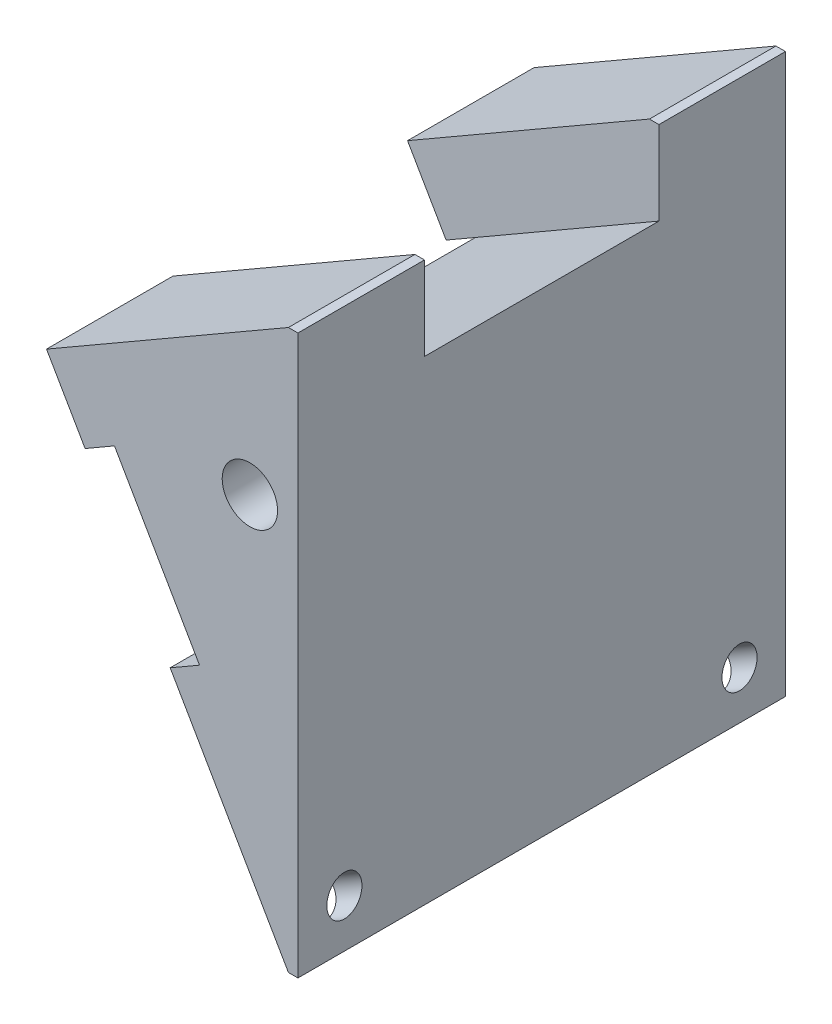
ISO-10303-21;
HEADER;
FILE_DESCRIPTION(('STEP AP214'),'2;1');
FILE_NAME('part.step','',(''),(''),'','','');
FILE_SCHEMA(('AUTOMOTIVE_DESIGN { 1 0 10303 214 1 1 1 1 }'));
ENDSEC;
DATA;
#1=APPLICATION_CONTEXT('core data for automotive mechanical design processes');
#2=APPLICATION_PROTOCOL_DEFINITION('international standard','automotive_design',2000,#1);
#3=PRODUCT_CONTEXT('',#1,'mechanical');
#4=PRODUCT('Part','Part','',(#3));
#5=PRODUCT_RELATED_PRODUCT_CATEGORY('part','',(#4));
#6=PRODUCT_DEFINITION_FORMATION('','',#4);
#7=PRODUCT_DEFINITION_CONTEXT('part definition',#1,'design');
#8=PRODUCT_DEFINITION('design','',#6,#7);
#9=PRODUCT_DEFINITION_SHAPE('','',#8);
#10=(LENGTH_UNIT() NAMED_UNIT(*) SI_UNIT(.MILLI.,.METRE.));
#11=(NAMED_UNIT(*) PLANE_ANGLE_UNIT() SI_UNIT($,.RADIAN.));
#12=(NAMED_UNIT(*) SI_UNIT($,.STERADIAN.) SOLID_ANGLE_UNIT());
#13=UNCERTAINTY_MEASURE_WITH_UNIT(LENGTH_MEASURE(1.E-05),#10,'distance_accuracy_value','');
#14=(GEOMETRIC_REPRESENTATION_CONTEXT(3) GLOBAL_UNCERTAINTY_ASSIGNED_CONTEXT((#13)) GLOBAL_UNIT_ASSIGNED_CONTEXT((#10,
#11,#12)) REPRESENTATION_CONTEXT('',''));
#15=CARTESIAN_POINT('',(0.,0.,0.));
#16=DIRECTION('',(0.,0.,1.));
#17=DIRECTION('',(1.,0.,0.));
#18=AXIS2_PLACEMENT_3D('',#15,#16,#17);
#19=CARTESIAN_POINT('',(2.97818413586759,12.1280444977001,15.2618117725888));
#20=DIRECTION('',(0.,1.,0.));
#21=DIRECTION('',(-1.,0.,0.));
#22=AXIS2_PLACEMENT_3D('',#19,#20,#21);
#23=PLANE('',#22);
#24=DIRECTION('',(1.,0.,0.));
#25=VECTOR('',#24,1.);
#26=CARTESIAN_POINT('',(2.97818413586759,12.1280444977001,-11.6431828959599));
#27=LINE('',#26,#25);
#28=CARTESIAN_POINT('',(-3.23788343563505,12.1280444977,-11.6431828959599));
#29=VERTEX_POINT('',#28);
#30=CARTESIAN_POINT('',(-2.7211971298804,12.1280444977001,-11.6431828959599));
#31=VERTEX_POINT('',#30);
#32=EDGE_CURVE('E56',#29,#31,#27,.T.);
#33=ORIENTED_EDGE('',*,*,#32,.F.);
#34=DIRECTION('',(0.,0.,-1.));
#35=VECTOR('',#34,1.);
#36=CARTESIAN_POINT('',(-3.23788343563506,12.1280444977001,15.2618117725888));
#37=LINE('',#36,#35);
#38=CARTESIAN_POINT('',(-3.23788343563506,12.1280444977001,-4.79068556168559));
#39=VERTEX_POINT('',#38);
#40=EDGE_CURVE('E167',#39,#29,#37,.T.);
#41=ORIENTED_EDGE('',*,*,#40,.F.);
#42=DIRECTION('',(-1.,0.,0.));
#43=VECTOR('',#42,1.);
#44=CARTESIAN_POINT('',(2.97818413586759,12.1280444977001,-4.79068556168559));
#45=LINE('',#44,#43);
#46=CARTESIAN_POINT('',(-2.7211971298804,12.1280444977001,-4.79068556168558));
#47=VERTEX_POINT('',#46);
#48=EDGE_CURVE('E191',#47,#39,#45,.T.);
#49=ORIENTED_EDGE('',*,*,#48,.F.);
#50=DIRECTION('',(0.,0.,-1.));
#51=VECTOR('',#50,1.);
#52=CARTESIAN_POINT('',(-2.7211971298804,12.1280444977001,19.0988171040401));
#53=LINE('',#52,#51);
#54=EDGE_CURVE('E230',#47,#31,#53,.T.);
#55=ORIENTED_EDGE('',*,*,#54,.T.);
#56=EDGE_LOOP('',(#33,#41,#49,#55));
#57=FACE_BOUND('',#56,.T.);
#58=ADVANCED_FACE('F39',(#57),#23,.T.);
#59=CARTESIAN_POINT('',(-15.3378163264363,5.14214498601969,15.2618117725888));
#60=DIRECTION('',(-0.499999999999994,0.866025403784442,0.));
#61=DIRECTION('',(-0.866025403784442,-0.499999999999994,0.));
#62=AXIS2_PLACEMENT_3D('',#59,#60,#61);
#63=PLANE('',#62);
#64=DIRECTION('',(-0.866025403784442,-0.499999999999994,0.));
#65=VECTOR('',#64,1.);
#66=CARTESIAN_POINT('',(0.982624640053907,14.564755971316,-11.6431828959599));
#67=LINE('',#66,#65);
#68=CARTESIAN_POINT('',(-16.3378834356349,4.56475597131613,-11.6431828959599));
#69=VERTEX_POINT('',#68);
#70=EDGE_CURVE('E150',#29,#69,#67,.T.);
#71=ORIENTED_EDGE('',*,*,#70,.T.);
#72=DIRECTION('',(0.,0.,-1.));
#73=VECTOR('',#72,1.);
#74=CARTESIAN_POINT('',(-16.337883435635,4.56475597131615,15.2618117725888));
#75=LINE('',#74,#73);
#76=CARTESIAN_POINT('',(-16.3378834356349,4.56475597131614,-4.79068556168559));
#77=VERTEX_POINT('',#76);
#78=EDGE_CURVE('E165',#77,#69,#75,.T.);
#79=ORIENTED_EDGE('',*,*,#78,.F.);
#80=DIRECTION('',(-0.866025403784441,-0.499999999999996,0.));
#81=VECTOR('',#80,1.);
#82=CARTESIAN_POINT('',(-16.3378834356349,4.56475597131614,-4.79068556168559));
#83=LINE('',#82,#81);
#84=EDGE_CURVE('E274',#39,#77,#83,.T.);
#85=ORIENTED_EDGE('',*,*,#84,.F.);
#86=ORIENTED_EDGE('',*,*,#40,.T.);
#87=EDGE_LOOP('',(#71,#79,#85,#86));
#88=FACE_BOUND('',#87,.T.);
#89=ADVANCED_FACE('F163',(#88),#63,.T.);
#90=CARTESIAN_POINT('',(-15.067883435635,2.36505144570368,15.2618117725888));
#91=DIRECTION('',(-0.866025403784442,-0.499999999999994,0.));
#92=DIRECTION('',(0.499999999999994,-0.866025403784442,0.));
#93=AXIS2_PLACEMENT_3D('',#90,#91,#92);
#94=PLANE('',#93);
#95=DIRECTION('',(-0.499999999999994,0.866025403784442,0.));
#96=VECTOR('',#95,1.);
#97=CARTESIAN_POINT('',(-16.3378834356349,4.56475597131613,-11.6431828959599));
#98=LINE('',#97,#96);
#99=CARTESIAN_POINT('',(-14.2480407854829,0.945042321428329,-11.6431828959599));
#100=VERTEX_POINT('',#99);
#101=EDGE_CURVE('E146',#100,#69,#98,.T.);
#102=ORIENTED_EDGE('',*,*,#101,.F.);
#103=DIRECTION('',(0.,0.,-1.));
#104=VECTOR('',#103,1.);
#105=CARTESIAN_POINT('',(-14.2480407854829,0.945042321428339,15.2618117725888));
#106=LINE('',#105,#104);
#107=CARTESIAN_POINT('',(-14.2480407854829,0.945042321428345,-4.79068556168559));
#108=VERTEX_POINT('',#107);
#109=EDGE_CURVE('E177',#108,#100,#106,.T.);
#110=ORIENTED_EDGE('',*,*,#109,.F.);
#111=DIRECTION('',(-0.499999999999996,0.866025403784441,0.));
#112=VECTOR('',#111,1.);
#113=CARTESIAN_POINT('',(-14.2480407854829,0.945042321428345,-4.79068556168559));
#114=LINE('',#113,#112);
#115=EDGE_CURVE('E173',#108,#77,#114,.T.);
#116=ORIENTED_EDGE('',*,*,#115,.T.);
#117=ORIENTED_EDGE('',*,*,#78,.T.);
#118=EDGE_LOOP('',(#102,#110,#116,#117));
#119=FACE_BOUND('',#118,.T.);
#120=CARTESIAN_POINT('',(-15.337883435635,2.83270516374728,-9.15418822741125));
#121=DIRECTION('',(-0.866025403784442,-0.499999999999994,0.));
#122=DIRECTION('',(0.499999999999994,-0.866025403784442,0.));
#123=AXIS2_PLACEMENT_3D('',#120,#121,#122);
#124=CIRCLE('',#123,0.949999999999999);
#125=CARTESIAN_POINT('',(-14.862883435635,2.00998103015206,-9.15418822741125));
#126=VERTEX_POINT('',#125);
#127=EDGE_CURVE('E250',#126,#126,#124,.T.);
#128=ORIENTED_EDGE('',*,*,#127,.F.);
#129=EDGE_LOOP('',(#128));
#130=FACE_BOUND('',#129,.T.);
#131=ADVANCED_FACE('F171',(#119,#130),#94,.T.);
#132=CARTESIAN_POINT('',(-12.6578327759487,1.86314934380036,15.2618117725888));
#133=DIRECTION('',(0.499999999999994,-0.866025403784442,0.));
#134=DIRECTION('',(0.866025403784442,0.499999999999994,0.));
#135=AXIS2_PLACEMENT_3D('',#132,#133,#134);
#136=PLANE('',#135);
#137=DIRECTION('',(-0.866025403784442,-0.499999999999994,0.));
#138=VECTOR('',#137,1.);
#139=CARTESIAN_POINT('',(-12.6578327759487,1.86314934380036,-11.6431828959599));
#140=LINE('',#139,#138);
#141=CARTESIAN_POINT('',(-12.6578327759487,1.86314934380036,-11.6431828959599));
#142=VERTEX_POINT('',#141);
#143=EDGE_CURVE('E152',#142,#100,#140,.T.);
#144=ORIENTED_EDGE('',*,*,#143,.F.);
#145=DIRECTION('',(0.,0.,-1.));
#146=VECTOR('',#145,1.);
#147=CARTESIAN_POINT('',(-12.6578327759487,1.86314934380036,15.2618117725888));
#148=LINE('',#147,#146);
#149=CARTESIAN_POINT('',(-12.6578327759487,1.86314934380036,-4.79068556168559));
#150=VERTEX_POINT('',#149);
#151=EDGE_CURVE('E185',#150,#142,#148,.T.);
#152=ORIENTED_EDGE('',*,*,#151,.F.);
#153=DIRECTION('',(-0.866025403784441,-0.499999999999996,0.));
#154=VECTOR('',#153,1.);
#155=CARTESIAN_POINT('',(-1.14804078548299,8.50833084781229,-4.79068556168559));
#156=LINE('',#155,#154);
#157=EDGE_CURVE('E267',#150,#108,#156,.T.);
#158=ORIENTED_EDGE('',*,*,#157,.T.);
#159=ORIENTED_EDGE('',*,*,#109,.T.);
#160=EDGE_LOOP('',(#144,#152,#158,#159));
#161=FACE_BOUND('',#160,.T.);
#162=ADVANCED_FACE('F317',(#161),#136,.T.);
#163=CARTESIAN_POINT('',(0.,-18.1251096078362,0.));
#164=DIRECTION('',(0.,1.,0.));
#165=DIRECTION('',(0.,0.,1.));
#166=AXIS2_PLACEMENT_3D('',#163,#164,#165);
#167=PLANE('',#166);
#168=DIRECTION('',(0.,0.,1.));
#169=VECTOR('',#168,1.);
#170=CARTESIAN_POINT('',(-3.23788343563507,-18.1251096078362,-12.1431828959599));
#171=LINE('',#170,#169);
#172=CARTESIAN_POINT('',(-3.23788343563512,-18.1251096078362,-11.6431828959599));
#173=VERTEX_POINT('',#172);
#174=CARTESIAN_POINT('',(-3.23788343563512,-18.1251096078362,14.7618117725888));
#175=VERTEX_POINT('',#174);
#176=EDGE_CURVE('E11',#173,#175,#171,.T.);
#177=ORIENTED_EDGE('',*,*,#176,.F.);
#178=DIRECTION('',(1.,0.,0.));
#179=VECTOR('',#178,1.);
#180=CARTESIAN_POINT('',(0.,-18.1251096078362,-11.6431828959599));
#181=LINE('',#180,#179);
#182=CARTESIAN_POINT('',(-2.7211971298804,-18.1251096078362,-11.6431828959599));
#183=VERTEX_POINT('',#182);
#184=EDGE_CURVE('E220',#173,#183,#181,.T.);
#185=ORIENTED_EDGE('',*,*,#184,.T.);
#186=DIRECTION('',(0.,0.,-1.));
#187=VECTOR('',#186,1.);
#188=CARTESIAN_POINT('',(-2.7211971298804,-18.1251096078362,19.0988171040401));
#189=LINE('',#188,#187);
#190=CARTESIAN_POINT('',(-2.7211971298804,-18.1251096078362,14.7618117725888));
#191=VERTEX_POINT('',#190);
#192=EDGE_CURVE('E229',#191,#183,#189,.T.);
#193=ORIENTED_EDGE('',*,*,#192,.F.);
#194=DIRECTION('',(-1.,0.,0.));
#195=VECTOR('',#194,1.);
#196=CARTESIAN_POINT('',(0.,-18.1251096078362,14.7618117725888));
#197=LINE('',#196,#195);
#198=EDGE_CURVE('E64',#191,#175,#197,.T.);
#199=ORIENTED_EDGE('',*,*,#198,.T.);
#200=EDGE_LOOP('',(#177,#185,#193,#199));
#201=FACE_BOUND('',#200,.T.);
#202=ADVANCED_FACE('F41',(#201),#167,.F.);
#203=DIRECTION('',(-1.,0.,0.));
#204=VECTOR('',#203,1.);
#205=CARTESIAN_POINT('',(2.97818413586759,12.1280444977001,14.7618117725888));
#206=LINE('',#205,#204);
#207=CARTESIAN_POINT('',(-2.7211971298804,12.1280444977001,14.7618117725888));
#208=VERTEX_POINT('',#207);
#209=CARTESIAN_POINT('',(-3.23788343563505,12.1280444977,14.7618117725888));
#210=VERTEX_POINT('',#209);
#211=EDGE_CURVE('E201',#208,#210,#206,.T.);
#212=ORIENTED_EDGE('',*,*,#211,.F.);
#213=CARTESIAN_POINT('',(-2.7211971298804,12.1280444977001,7.90931443831442));
#214=VERTEX_POINT('',#213);
#215=EDGE_CURVE('E196',#208,#214,#53,.T.);
#216=ORIENTED_EDGE('',*,*,#215,.T.);
#217=DIRECTION('',(1.,0.,0.));
#218=VECTOR('',#217,1.);
#219=CARTESIAN_POINT('',(2.97818413586759,12.1280444977001,7.90931443831441));
#220=LINE('',#219,#218);
#221=CARTESIAN_POINT('',(-3.23788343563507,12.1280444977001,7.90931443831441));
#222=VERTEX_POINT('',#221);
#223=EDGE_CURVE('E277',#222,#214,#220,.T.);
#224=ORIENTED_EDGE('',*,*,#223,.F.);
#225=EDGE_CURVE('E48',#210,#222,#37,.T.);
#226=ORIENTED_EDGE('',*,*,#225,.F.);
#227=EDGE_LOOP('',(#212,#216,#224,#226));
#228=FACE_BOUND('',#227,.T.);
#229=ADVANCED_FACE('F300',(#228),#23,.T.);
#230=DIRECTION('',(-0.866025403784442,-0.499999999999994,0.));
#231=VECTOR('',#230,1.);
#232=CARTESIAN_POINT('',(0.982624640053907,14.564755971316,14.7618117725888));
#233=LINE('',#232,#231);
#234=CARTESIAN_POINT('',(-16.3378834356349,4.56475597131613,14.7618117725888));
#235=VERTEX_POINT('',#234);
#236=EDGE_CURVE('E158',#210,#235,#233,.T.);
#237=ORIENTED_EDGE('',*,*,#236,.F.);
#238=ORIENTED_EDGE('',*,*,#225,.T.);
#239=DIRECTION('',(0.866025403784441,0.499999999999996,0.));
#240=VECTOR('',#239,1.);
#241=CARTESIAN_POINT('',(1.42416724299198,14.819680711981,7.90931443831441));
#242=LINE('',#241,#240);
#243=CARTESIAN_POINT('',(-16.3378834356349,4.56475597131614,7.90931443831441));
#244=VERTEX_POINT('',#243);
#245=EDGE_CURVE('E261',#244,#222,#242,.T.);
#246=ORIENTED_EDGE('',*,*,#245,.F.);
#247=EDGE_CURVE('E174',#235,#244,#75,.T.);
#248=ORIENTED_EDGE('',*,*,#247,.F.);
#249=EDGE_LOOP('',(#237,#238,#246,#248));
#250=FACE_BOUND('',#249,.T.);
#251=ADVANCED_FACE('F291',(#250),#63,.T.);
#252=DIRECTION('',(0.499999999999994,-0.866025403784442,0.));
#253=VECTOR('',#252,1.);
#254=CARTESIAN_POINT('',(-16.3378834356349,4.56475597131613,14.7618117725888));
#255=LINE('',#254,#253);
#256=CARTESIAN_POINT('',(-14.2480407854829,0.945042321428329,14.7618117725888));
#257=VERTEX_POINT('',#256);
#258=EDGE_CURVE('E566',#235,#257,#255,.T.);
#259=ORIENTED_EDGE('',*,*,#258,.F.);
#260=ORIENTED_EDGE('',*,*,#247,.T.);
#261=DIRECTION('',(-0.499999999999996,0.866025403784441,0.));
#262=VECTOR('',#261,1.);
#263=CARTESIAN_POINT('',(-14.2480407854829,0.945042321428344,7.90931443831441));
#264=LINE('',#263,#262);
#265=CARTESIAN_POINT('',(-14.2480407854829,0.945042321428344,7.90931443831441));
#266=VERTEX_POINT('',#265);
#267=EDGE_CURVE('E278',#266,#244,#264,.T.);
#268=ORIENTED_EDGE('',*,*,#267,.F.);
#269=EDGE_CURVE('E175',#257,#266,#106,.T.);
#270=ORIENTED_EDGE('',*,*,#269,.F.);
#271=EDGE_LOOP('',(#259,#260,#268,#270));
#272=FACE_BOUND('',#271,.T.);
#273=CARTESIAN_POINT('',(-15.337883435635,2.83270516374728,12.2458117725888));
#274=DIRECTION('',(-0.866025403784442,-0.499999999999994,0.));
#275=DIRECTION('',(0.499999999999994,-0.866025403784442,0.));
#276=AXIS2_PLACEMENT_3D('',#273,#274,#275);
#277=CIRCLE('',#276,0.949999999999999);
#278=CARTESIAN_POINT('',(-14.862883435635,2.00998103015206,12.2458117725888));
#279=VERTEX_POINT('',#278);
#280=EDGE_CURVE('E249',#279,#279,#277,.T.);
#281=ORIENTED_EDGE('',*,*,#280,.F.);
#282=EDGE_LOOP('',(#281));
#283=FACE_BOUND('',#282,.T.);
#284=ADVANCED_FACE('F327',(#272,#283),#94,.T.);
#285=DIRECTION('',(0.866025403784442,0.499999999999994,0.));
#286=VECTOR('',#285,1.);
#287=CARTESIAN_POINT('',(-12.6578327759487,1.86314934380036,14.7618117725888));
#288=LINE('',#287,#286);
#289=CARTESIAN_POINT('',(-12.6578327759487,1.86314934380036,14.7618117725888));
#290=VERTEX_POINT('',#289);
#291=EDGE_CURVE('E216',#257,#290,#288,.T.);
#292=ORIENTED_EDGE('',*,*,#291,.F.);
#293=ORIENTED_EDGE('',*,*,#269,.T.);
#294=DIRECTION('',(0.866025403784441,0.499999999999996,0.));
#295=VECTOR('',#294,1.);
#296=CARTESIAN_POINT('',(-1.14804078548299,8.50833084781229,7.90931443831441));
#297=LINE('',#296,#295);
#298=CARTESIAN_POINT('',(-12.6578327759487,1.86314934380036,7.90931443831441));
#299=VERTEX_POINT('',#298);
#300=EDGE_CURVE('E264',#266,#299,#297,.T.);
#301=ORIENTED_EDGE('',*,*,#300,.T.);
#302=EDGE_CURVE('E182',#290,#299,#148,.T.);
#303=ORIENTED_EDGE('',*,*,#302,.F.);
#304=EDGE_LOOP('',(#292,#293,#301,#303));
#305=FACE_BOUND('',#304,.T.);
#306=ADVANCED_FACE('F320',(#305),#136,.T.);
#307=CARTESIAN_POINT('',(-8.19767542610088,-5.862069795888,15.2618117725888));
#308=DIRECTION('',(-0.866025403784442,-0.499999999999994,0.));
#309=DIRECTION('',(0.499999999999994,-0.866025403784442,0.));
#310=AXIS2_PLACEMENT_3D('',#307,#308,#309);
#311=PLANE('',#310);
#312=DIRECTION('',(-0.499999999999994,0.866025403784442,0.));
#313=VECTOR('',#312,1.);
#314=CARTESIAN_POINT('',(-8.19767542610088,-5.862069795888,-11.6431828959599));
#315=LINE('',#314,#313);
#316=CARTESIAN_POINT('',(-8.05055257917194,-6.11689404172312,-11.6431828959599));
#317=VERTEX_POINT('',#316);
#318=EDGE_CURVE('E226',#317,#142,#315,.T.);
#319=ORIENTED_EDGE('',*,*,#318,.F.);
#320=DIRECTION('',(0.,0.,-1.));
#321=VECTOR('',#320,1.);
#322=CARTESIAN_POINT('',(-8.05055257917194,-6.11689404172312,15.2618117725888));
#323=LINE('',#322,#321);
#324=CARTESIAN_POINT('',(-8.05055257917194,-6.11689404172312,14.7618117725888));
#325=VERTEX_POINT('',#324);
#326=EDGE_CURVE('E186',#325,#317,#323,.T.);
#327=ORIENTED_EDGE('',*,*,#326,.F.);
#328=DIRECTION('',(0.499999999999994,-0.866025403784442,0.));
#329=VECTOR('',#328,1.);
#330=CARTESIAN_POINT('',(-8.19767542610088,-5.862069795888,14.7618117725888));
#331=LINE('',#330,#329);
#332=EDGE_CURVE('E214',#290,#325,#331,.T.);
#333=ORIENTED_EDGE('',*,*,#332,.F.);
#334=ORIENTED_EDGE('',*,*,#302,.T.);
#335=EDGE_CURVE('E184',#299,#150,#148,.T.);
#336=ORIENTED_EDGE('',*,*,#335,.T.);
#337=ORIENTED_EDGE('',*,*,#151,.T.);
#338=EDGE_LOOP('',(#319,#327,#333,#334,#336,#337));
#339=FACE_BOUND('',#338,.T.);
#340=ADVANCED_FACE('F314',(#339),#311,.T.);
#341=CARTESIAN_POINT('',(-8.05055257917194,-6.11689404172312,15.2618117725888));
#342=DIRECTION('',(-0.499999999999994,0.866025403784442,0.));
#343=DIRECTION('',(-0.866025403784442,-0.499999999999994,0.));
#344=AXIS2_PLACEMENT_3D('',#341,#342,#343);
#345=PLANE('',#344);
#346=DIRECTION('',(0.866025403784442,0.499999999999994,0.));
#347=VECTOR('',#346,1.);
#348=CARTESIAN_POINT('',(-8.05055257917194,-6.11689404172312,-11.6431828959599));
#349=LINE('',#348,#347);
#350=CARTESIAN_POINT('',(-9.64076058870609,-7.03500106409515,-11.6431828959599));
#351=VERTEX_POINT('',#350);
#352=EDGE_CURVE('E224',#351,#317,#349,.T.);
#353=ORIENTED_EDGE('',*,*,#352,.F.);
#354=DIRECTION('',(0.,0.,-1.));
#355=VECTOR('',#354,1.);
#356=CARTESIAN_POINT('',(-9.64076058870605,-7.03500106409512,15.2618117725888));
#357=LINE('',#356,#355);
#358=CARTESIAN_POINT('',(-9.64076058870609,-7.03500106409515,14.7618117725888));
#359=VERTEX_POINT('',#358);
#360=EDGE_CURVE('E189',#359,#351,#357,.T.);
#361=ORIENTED_EDGE('',*,*,#360,.F.);
#362=DIRECTION('',(-0.866025403784442,-0.499999999999994,0.));
#363=VECTOR('',#362,1.);
#364=CARTESIAN_POINT('',(-8.05055257917194,-6.11689404172312,14.7618117725888));
#365=LINE('',#364,#363);
#366=EDGE_CURVE('E212',#325,#359,#365,.T.);
#367=ORIENTED_EDGE('',*,*,#366,.F.);
#368=ORIENTED_EDGE('',*,*,#326,.T.);
#369=EDGE_LOOP('',(#353,#361,#367,#368));
#370=FACE_BOUND('',#369,.T.);
#371=ADVANCED_FACE('F418',(#370),#345,.T.);
#372=CARTESIAN_POINT('',(-3.23788343563507,-18.1251096078362,15.2618117725888));
#373=DIRECTION('',(-0.866025403784442,-0.499999999999994,0.));
#374=DIRECTION('',(0.499999999999994,-0.866025403784442,0.));
#375=AXIS2_PLACEMENT_3D('',#372,#373,#374);
#376=PLANE('',#375);
#377=EDGE_CURVE('E157',#173,#351,#98,.T.);
#378=ORIENTED_EDGE('',*,*,#377,.F.);
#379=ORIENTED_EDGE('',*,*,#176,.T.);
#380=EDGE_CURVE('E565',#359,#175,#255,.T.);
#381=ORIENTED_EDGE('',*,*,#380,.F.);
#382=ORIENTED_EDGE('',*,*,#360,.T.);
#383=EDGE_LOOP('',(#378,#379,#381,#382));
#384=FACE_BOUND('',#383,.T.);
#385=CARTESIAN_POINT('',(-4.2378834356351,-16.3930588002673,12.2458117725888));
#386=DIRECTION('',(-0.866025403784442,-0.499999999999994,0.));
#387=DIRECTION('',(0.499999999999994,-0.866025403784442,0.));
#388=AXIS2_PLACEMENT_3D('',#385,#386,#387);
#389=CIRCLE('',#388,0.949999999999999);
#390=CARTESIAN_POINT('',(-3.76288343563511,-17.2157829338626,12.2458117725888));
#391=VERTEX_POINT('',#390);
#392=EDGE_CURVE('E245',#391,#391,#389,.T.);
#393=ORIENTED_EDGE('',*,*,#392,.F.);
#394=EDGE_LOOP('',(#393));
#395=FACE_BOUND('',#394,.T.);
#396=CARTESIAN_POINT('',(-4.2378834356351,-16.3930588002673,-9.15418822741125));
#397=DIRECTION('',(-0.866025403784442,-0.499999999999994,0.));
#398=DIRECTION('',(0.499999999999994,-0.866025403784442,0.));
#399=AXIS2_PLACEMENT_3D('',#396,#397,#398);
#400=CIRCLE('',#399,0.949999999999999);
#401=CARTESIAN_POINT('',(-3.76288343563511,-17.2157829338626,-9.15418822741125));
#402=VERTEX_POINT('',#401);
#403=EDGE_CURVE('E253',#402,#402,#400,.T.);
#404=ORIENTED_EDGE('',*,*,#403,.F.);
#405=EDGE_LOOP('',(#404));
#406=FACE_BOUND('',#405,.T.);
#407=ADVANCED_FACE('F350',(#384,#395,#406),#376,.T.);
#408=CARTESIAN_POINT('',(-14.2480407854829,0.945042321428345,-4.79068556168559));
#409=DIRECTION('',(0.,0.,-1.));
#410=DIRECTION('',(-1.,0.,0.));
#411=AXIS2_PLACEMENT_3D('',#408,#409,#410);
#412=PLANE('',#411);
#413=CARTESIAN_POINT('',(-2.72119712988039,7.60006860889709,-4.79068556168559));
#414=VERTEX_POINT('',#413);
#415=EDGE_CURVE('E271',#414,#150,#156,.T.);
#416=ORIENTED_EDGE('',*,*,#415,.F.);
#417=DIRECTION('',(0.,1.,0.));
#418=VECTOR('',#417,1.);
#419=CARTESIAN_POINT('',(-2.7211971298804,0.945042321428345,-4.79068556168559));
#420=LINE('',#419,#418);
#421=EDGE_CURVE('E242',#414,#47,#420,.T.);
#422=ORIENTED_EDGE('',*,*,#421,.T.);
#423=ORIENTED_EDGE('',*,*,#48,.T.);
#424=ORIENTED_EDGE('',*,*,#84,.T.);
#425=ORIENTED_EDGE('',*,*,#115,.F.);
#426=ORIENTED_EDGE('',*,*,#157,.F.);
#427=EDGE_LOOP('',(#416,#422,#423,#424,#425,#426));
#428=FACE_BOUND('',#427,.T.);
#429=ADVANCED_FACE('F285',(#428),#412,.F.);
#430=CARTESIAN_POINT('',(3.51400989314403,11.1999670620932,7.90931443831441));
#431=DIRECTION('',(0.,0.,1.));
#432=DIRECTION('',(1.,0.,0.));
#433=AXIS2_PLACEMENT_3D('',#430,#431,#432);
#434=PLANE('',#433);
#435=ORIENTED_EDGE('',*,*,#223,.T.);
#436=DIRECTION('',(0.,-1.,0.));
#437=VECTOR('',#436,1.);
#438=CARTESIAN_POINT('',(-2.7211971298804,11.1999670620932,7.90931443831441));
#439=LINE('',#438,#437);
#440=CARTESIAN_POINT('',(-2.7211971298804,7.60006860889709,7.90931443831441));
#441=VERTEX_POINT('',#440);
#442=EDGE_CURVE('E239',#214,#441,#439,.T.);
#443=ORIENTED_EDGE('',*,*,#442,.T.);
#444=EDGE_CURVE('E268',#299,#441,#297,.T.);
#445=ORIENTED_EDGE('',*,*,#444,.F.);
#446=ORIENTED_EDGE('',*,*,#300,.F.);
#447=ORIENTED_EDGE('',*,*,#267,.T.);
#448=ORIENTED_EDGE('',*,*,#245,.T.);
#449=EDGE_LOOP('',(#435,#443,#445,#446,#447,#448));
#450=FACE_BOUND('',#449,.T.);
#451=ADVANCED_FACE('F297',(#450),#434,.F.);
#452=CARTESIAN_POINT('',(-3.97122552537484,6.8783643782637,0.));
#453=DIRECTION('',(0.499999999999996,-0.866025403784441,0.));
#454=DIRECTION('',(0.866025403784441,0.499999999999996,0.));
#455=AXIS2_PLACEMENT_3D('',#452,#453,#454);
#456=PLANE('',#455);
#457=ORIENTED_EDGE('',*,*,#444,.T.);
#458=DIRECTION('',(0.,0.,-1.));
#459=VECTOR('',#458,1.);
#460=CARTESIAN_POINT('',(-2.7211971298804,7.60006860889709,0.));
#461=LINE('',#460,#459);
#462=EDGE_CURVE('E236',#441,#414,#461,.T.);
#463=ORIENTED_EDGE('',*,*,#462,.T.);
#464=ORIENTED_EDGE('',*,*,#415,.T.);
#465=ORIENTED_EDGE('',*,*,#335,.F.);
#466=EDGE_LOOP('',(#457,#463,#464,#465));
#467=FACE_BOUND('',#466,.T.);
#468=ADVANCED_FACE('F307',(#467),#456,.F.);
#469=CARTESIAN_POINT('',(1.48134833095735,-13.0910588002674,-9.15418822741125));
#470=DIRECTION('',(-0.866025403784442,-0.499999999999994,0.));
#471=DIRECTION('',(0.499999999999994,-0.866025403784442,0.));
#472=AXIS2_PLACEMENT_3D('',#469,#470,#471);
#473=CYLINDRICAL_SURFACE('',#472,0.949999999999999);
#474=CARTESIAN_POINT('',(-2.7211971298804,-15.5173995533637,-9.15418822741125));
#475=DIRECTION('',(-1.,0.,0.));
#476=DIRECTION('',(0.,-1.,0.));
#477=AXIS2_PLACEMENT_3D('',#474,#475,#476);
#478=ELLIPSE('',#477,1.09696551146028,0.949999999999999);
#479=CARTESIAN_POINT('',(-2.7211971298804,-16.6143650648239,-9.15418822741125));
#480=VERTEX_POINT('',#479);
#481=EDGE_CURVE('E195',#480,#480,#478,.F.);
#482=ORIENTED_EDGE('',*,*,#481,.T.);
#483=EDGE_LOOP('',(#482));
#484=FACE_BOUND('',#483,.T.);
#485=ORIENTED_EDGE('',*,*,#403,.T.);
#486=EDGE_LOOP('',(#485));
#487=FACE_BOUND('',#486,.T.);
#488=ADVANCED_FACE('F353',(#484,#487),#473,.F.);
#489=CARTESIAN_POINT('',(1.48134833095735,-13.0910588002674,12.2458117725888));
#490=DIRECTION('',(-0.866025403784442,-0.499999999999994,0.));
#491=DIRECTION('',(0.499999999999994,-0.866025403784442,0.));
#492=AXIS2_PLACEMENT_3D('',#489,#490,#491);
#493=CYLINDRICAL_SURFACE('',#492,0.949999999999999);
#494=CARTESIAN_POINT('',(-2.7211971298804,-15.5173995533637,12.2458117725888));
#495=DIRECTION('',(-1.,0.,0.));
#496=DIRECTION('',(0.,-1.,0.));
#497=AXIS2_PLACEMENT_3D('',#494,#495,#496);
#498=ELLIPSE('',#497,1.09696551146028,0.949999999999999);
#499=CARTESIAN_POINT('',(-2.7211971298804,-16.6143650648239,12.2458117725888));
#500=VERTEX_POINT('',#499);
#501=EDGE_CURVE('E193',#500,#500,#498,.F.);
#502=ORIENTED_EDGE('',*,*,#501,.T.);
#503=EDGE_LOOP('',(#502));
#504=FACE_BOUND('',#503,.T.);
#505=ORIENTED_EDGE('',*,*,#392,.T.);
#506=EDGE_LOOP('',(#505));
#507=FACE_BOUND('',#506,.T.);
#508=ADVANCED_FACE('F358',(#504,#507),#493,.F.);
#509=CARTESIAN_POINT('',(-9.61865166904252,6.13470516374724,12.2458117725888));
#510=DIRECTION('',(-0.866025403784442,-0.499999999999994,0.));
#511=DIRECTION('',(0.499999999999994,-0.866025403784442,0.));
#512=AXIS2_PLACEMENT_3D('',#509,#510,#511);
#513=CYLINDRICAL_SURFACE('',#512,0.949999999999999);
#514=CARTESIAN_POINT('',(-9.61865166904252,6.13470516374724,12.2458117725888));
#515=DIRECTION('',(-0.866025403784442,-0.499999999999994,0.));
#516=DIRECTION('',(0.499999999999994,-0.866025403784442,0.));
#517=AXIS2_PLACEMENT_3D('',#514,#515,#516);
#518=CIRCLE('',#517,0.949999999999999);
#519=CARTESIAN_POINT('',(-9.14365166904252,5.31198103015202,12.2458117725888));
#520=VERTEX_POINT('',#519);
#521=EDGE_CURVE('E258',#520,#520,#518,.T.);
#522=ORIENTED_EDGE('',*,*,#521,.F.);
#523=EDGE_LOOP('',(#522));
#524=FACE_BOUND('',#523,.T.);
#525=ORIENTED_EDGE('',*,*,#280,.T.);
#526=EDGE_LOOP('',(#525));
#527=FACE_BOUND('',#526,.T.);
#528=ADVANCED_FACE('F354',(#524,#527),#513,.F.);
#529=CARTESIAN_POINT('',(-9.61865166904252,6.13470516374724,12.2458117725888));
#530=DIRECTION('',(-0.866025403784442,-0.499999999999994,0.));
#531=DIRECTION('',(0.499999999999994,-0.866025403784442,0.));
#532=AXIS2_PLACEMENT_3D('',#529,#530,#531);
#533=PLANE('',#532);
#534=ORIENTED_EDGE('',*,*,#521,.T.);
#535=EDGE_LOOP('',(#534));
#536=FACE_BOUND('',#535,.T.);
#537=ADVANCED_FACE('F357',(#536),#533,.T.);
#538=CARTESIAN_POINT('',(-9.61865166904252,6.13470516374724,-9.15418822741125));
#539=DIRECTION('',(-0.866025403784442,-0.499999999999994,0.));
#540=DIRECTION('',(0.499999999999994,-0.866025403784442,0.));
#541=AXIS2_PLACEMENT_3D('',#538,#539,#540);
#542=CYLINDRICAL_SURFACE('',#541,0.949999999999999);
#543=CARTESIAN_POINT('',(-9.61865166904252,6.13470516374724,-9.15418822741125));
#544=DIRECTION('',(-0.866025403784442,-0.499999999999994,0.));
#545=DIRECTION('',(0.499999999999994,-0.866025403784442,0.));
#546=AXIS2_PLACEMENT_3D('',#543,#544,#545);
#547=CIRCLE('',#546,0.949999999999999);
#548=CARTESIAN_POINT('',(-9.14365166904252,5.31198103015202,-9.15418822741125));
#549=VERTEX_POINT('',#548);
#550=EDGE_CURVE('E246',#549,#549,#547,.T.);
#551=ORIENTED_EDGE('',*,*,#550,.F.);
#552=EDGE_LOOP('',(#551));
#553=FACE_BOUND('',#552,.T.);
#554=ORIENTED_EDGE('',*,*,#127,.T.);
#555=EDGE_LOOP('',(#554));
#556=FACE_BOUND('',#555,.T.);
#557=ADVANCED_FACE('F362',(#553,#556),#542,.F.);
#558=CARTESIAN_POINT('',(-9.61865166904252,6.13470516374724,-9.15418822741125));
#559=DIRECTION('',(-0.866025403784442,-0.499999999999994,0.));
#560=DIRECTION('',(0.499999999999994,-0.866025403784442,0.));
#561=AXIS2_PLACEMENT_3D('',#558,#559,#560);
#562=PLANE('',#561);
#563=ORIENTED_EDGE('',*,*,#550,.T.);
#564=EDGE_LOOP('',(#563));
#565=FACE_BOUND('',#564,.T.);
#566=ADVANCED_FACE('F372',(#565),#562,.T.);
#567=CARTESIAN_POINT('',(-2.7211971298804,12.1280444977001,19.0988171040401));
#568=DIRECTION('',(-1.,0.,0.));
#569=DIRECTION('',(0.,0.,1.));
#570=AXIS2_PLACEMENT_3D('',#567,#568,#569);
#571=PLANE('',#570);
#572=ORIENTED_EDGE('',*,*,#501,.F.);
#573=EDGE_LOOP('',(#572));
#574=FACE_BOUND('',#573,.T.);
#575=ORIENTED_EDGE('',*,*,#481,.F.);
#576=EDGE_LOOP('',(#575));
#577=FACE_BOUND('',#576,.T.);
#578=ORIENTED_EDGE('',*,*,#192,.T.);
#579=DIRECTION('',(0.,1.,0.));
#580=VECTOR('',#579,1.);
#581=CARTESIAN_POINT('',(-2.7211971298804,12.1280444977001,-11.6431828959599));
#582=LINE('',#581,#580);
#583=EDGE_CURVE('E218',#183,#31,#582,.T.);
#584=ORIENTED_EDGE('',*,*,#583,.T.);
#585=ORIENTED_EDGE('',*,*,#54,.F.);
#586=ORIENTED_EDGE('',*,*,#421,.F.);
#587=ORIENTED_EDGE('',*,*,#462,.F.);
#588=ORIENTED_EDGE('',*,*,#442,.F.);
#589=ORIENTED_EDGE('',*,*,#215,.F.);
#590=DIRECTION('',(0.,-1.,0.));
#591=VECTOR('',#590,1.);
#592=CARTESIAN_POINT('',(-2.7211971298804,12.1280444977001,14.7618117725888));
#593=LINE('',#592,#591);
#594=EDGE_CURVE('E198',#208,#191,#593,.T.);
#595=ORIENTED_EDGE('',*,*,#594,.T.);
#596=EDGE_LOOP('',(#578,#584,#585,#586,#587,#588,#589,#595));
#597=FACE_BOUND('',#596,.T.);
#598=ADVANCED_FACE('F302',(#574,#577,#597),#571,.F.);
#599=CARTESIAN_POINT('',(0.982624640053907,14.564755971316,14.7618117725888));
#600=DIRECTION('',(0.,0.,-1.));
#601=DIRECTION('',(0.,1.,0.));
#602=AXIS2_PLACEMENT_3D('',#599,#600,#601);
#603=PLANE('',#602);
#604=ORIENTED_EDGE('',*,*,#291,.T.);
#605=ORIENTED_EDGE('',*,*,#332,.T.);
#606=ORIENTED_EDGE('',*,*,#366,.T.);
#607=ORIENTED_EDGE('',*,*,#380,.T.);
#608=ORIENTED_EDGE('',*,*,#198,.F.);
#609=ORIENTED_EDGE('',*,*,#594,.F.);
#610=ORIENTED_EDGE('',*,*,#211,.T.);
#611=ORIENTED_EDGE('',*,*,#236,.T.);
#612=ORIENTED_EDGE('',*,*,#258,.T.);
#613=EDGE_LOOP('',(#604,#605,#606,#607,#608,#609,#610,#611,#612));
#614=FACE_BOUND('',#613,.T.);
#615=CARTESIAN_POINT('',(-5.32419712988083,3.24117634259168,14.7618117725888));
#616=DIRECTION('',(0.,0.,-1.));
#617=DIRECTION('',(0.,1.,0.));
#618=AXIS2_PLACEMENT_3D('',#615,#616,#617);
#619=CIRCLE('',#618,1.5);
#620=CARTESIAN_POINT('',(-5.32419712988083,4.74117634259168,14.7618117725888));
#621=VERTEX_POINT('',#620);
#622=EDGE_CURVE('E168',#621,#621,#619,.F.);
#623=ORIENTED_EDGE('',*,*,#622,.F.);
#624=EDGE_LOOP('',(#623));
#625=FACE_BOUND('',#624,.T.);
#626=ADVANCED_FACE('F379',(#614,#625),#603,.F.);
#627=CARTESIAN_POINT('',(0.982624640053907,14.564755971316,-11.6431828959599));
#628=DIRECTION('',(0.,0.,1.));
#629=DIRECTION('',(0.,-1.,0.));
#630=AXIS2_PLACEMENT_3D('',#627,#628,#629);
#631=PLANE('',#630);
#632=ORIENTED_EDGE('',*,*,#143,.T.);
#633=ORIENTED_EDGE('',*,*,#101,.T.);
#634=ORIENTED_EDGE('',*,*,#70,.F.);
#635=ORIENTED_EDGE('',*,*,#32,.T.);
#636=ORIENTED_EDGE('',*,*,#583,.F.);
#637=ORIENTED_EDGE('',*,*,#184,.F.);
#638=ORIENTED_EDGE('',*,*,#377,.T.);
#639=ORIENTED_EDGE('',*,*,#352,.T.);
#640=ORIENTED_EDGE('',*,*,#318,.T.);
#641=EDGE_LOOP('',(#632,#633,#634,#635,#636,#637,#638,#639,#640));
#642=FACE_BOUND('',#641,.T.);
#643=CARTESIAN_POINT('',(-5.32419712988083,3.24117634259168,-11.6431828959599));
#644=DIRECTION('',(0.,0.,1.));
#645=DIRECTION('',(0.,-1.,0.));
#646=AXIS2_PLACEMENT_3D('',#643,#644,#645);
#647=CIRCLE('',#646,1.5);
#648=CARTESIAN_POINT('',(-5.32419712988083,1.74117634259168,-11.6431828959599));
#649=VERTEX_POINT('',#648);
#650=EDGE_CURVE('E43',#649,#649,#647,.F.);
#651=ORIENTED_EDGE('',*,*,#650,.F.);
#652=EDGE_LOOP('',(#651));
#653=FACE_BOUND('',#652,.T.);
#654=ADVANCED_FACE('F148',(#642,#653),#631,.F.);
#655=CARTESIAN_POINT('',(-5.32419712988083,3.24117634259168,19.8608171040401));
#656=DIRECTION('',(0.,0.,-1.));
#657=DIRECTION('',(-1.,0.,0.));
#658=AXIS2_PLACEMENT_3D('',#655,#656,#657);
#659=CYLINDRICAL_SURFACE('',#658,1.5);
#660=ORIENTED_EDGE('',*,*,#650,.T.);
#661=EDGE_LOOP('',(#660));
#662=FACE_BOUND('',#661,.T.);
#663=ORIENTED_EDGE('',*,*,#622,.T.);
#664=EDGE_LOOP('',(#663));
#665=FACE_BOUND('',#664,.T.);
#666=ADVANCED_FACE('F381',(#662,#665),#659,.F.);
#667=CLOSED_SHELL('',(#58,#89,#131,#162,#202,#229,#251,#284,#306,#340,#371,#407,#429,#451,#468,
#488,#508,#528,#537,#557,#566,#598,#626,#654,#666));
#668=MANIFOLD_SOLID_BREP('B2',#667);
#669=ADVANCED_BREP_SHAPE_REPRESENTATION('',(#18,#668),#14);
#670=SHAPE_DEFINITION_REPRESENTATION(#9,#669);
ENDSEC;
END-ISO-10303-21;
